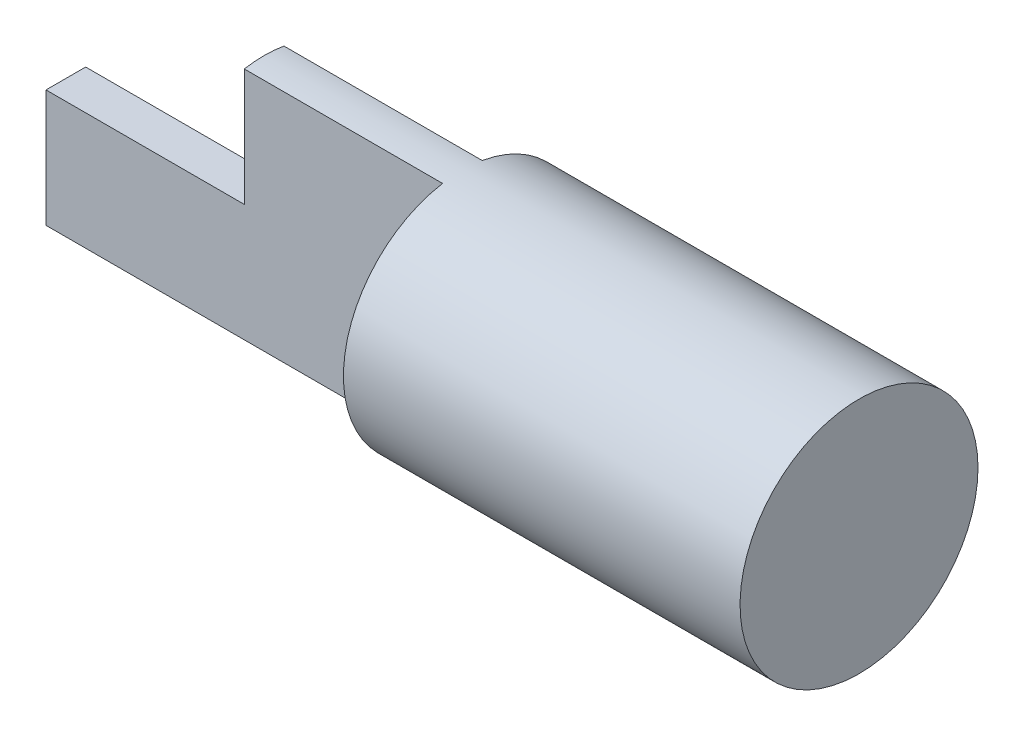
ISO-10303-21;
HEADER;
FILE_DESCRIPTION(('STEP AP214'),'2;1');
FILE_NAME('part.step','',(''),(''),'','','');
FILE_SCHEMA(('AUTOMOTIVE_DESIGN { 1 0 10303 214 1 1 1 1 }'));
ENDSEC;
DATA;
#1=APPLICATION_CONTEXT('core data for automotive mechanical design processes');
#2=APPLICATION_PROTOCOL_DEFINITION('international standard','automotive_design',2000,#1);
#3=PRODUCT_CONTEXT('',#1,'mechanical');
#4=PRODUCT('Part','Part','',(#3));
#5=PRODUCT_RELATED_PRODUCT_CATEGORY('part','',(#4));
#6=PRODUCT_DEFINITION_FORMATION('','',#4);
#7=PRODUCT_DEFINITION_CONTEXT('part definition',#1,'design');
#8=PRODUCT_DEFINITION('design','',#6,#7);
#9=PRODUCT_DEFINITION_SHAPE('','',#8);
#10=(LENGTH_UNIT() NAMED_UNIT(*) SI_UNIT(.MILLI.,.METRE.));
#11=(NAMED_UNIT(*) PLANE_ANGLE_UNIT() SI_UNIT($,.RADIAN.));
#12=(NAMED_UNIT(*) SI_UNIT($,.STERADIAN.) SOLID_ANGLE_UNIT());
#13=UNCERTAINTY_MEASURE_WITH_UNIT(LENGTH_MEASURE(1.E-05),#10,'distance_accuracy_value','');
#14=(GEOMETRIC_REPRESENTATION_CONTEXT(3) GLOBAL_UNCERTAINTY_ASSIGNED_CONTEXT((#13)) GLOBAL_UNIT_ASSIGNED_CONTEXT((#10,
#11,#12)) REPRESENTATION_CONTEXT('',''));
#15=CARTESIAN_POINT('',(0.,0.,0.));
#16=DIRECTION('',(0.,0.,1.));
#17=DIRECTION('',(1.,0.,0.));
#18=AXIS2_PLACEMENT_3D('',#15,#16,#17);
#19=CARTESIAN_POINT('',(-50.,1.19348975147204E-12,0.));
#20=DIRECTION('',(-1.,0.,0.));
#21=DIRECTION('',(0.,0.,1.));
#22=AXIS2_PLACEMENT_3D('',#19,#20,#21);
#23=PLANE('',#22);
#24=DIRECTION('',(0.,-1.,0.));
#25=VECTOR('',#24,1.);
#26=CARTESIAN_POINT('',(-50.,29.5803989154981,-4.99999999999999));
#27=LINE('',#26,#25);
#28=CARTESIAN_POINT('',(-50.,29.5803989154981,-4.99999999999999));
#29=VERTEX_POINT('',#28);
#30=CARTESIAN_POINT('',(-50.,0.,-4.99999999999999));
#31=VERTEX_POINT('',#30);
#32=EDGE_CURVE('E123',#29,#31,#27,.T.);
#33=ORIENTED_EDGE('',*,*,#32,.T.);
#34=DIRECTION('',(0.,0.,1.));
#35=VECTOR('',#34,1.);
#36=CARTESIAN_POINT('',(-50.,0.,0.));
#37=LINE('',#36,#35);
#38=CARTESIAN_POINT('',(-50.,0.,5.));
#39=VERTEX_POINT('',#38);
#40=EDGE_CURVE('E94',#31,#39,#37,.T.);
#41=ORIENTED_EDGE('',*,*,#40,.T.);
#42=DIRECTION('',(0.,1.,0.));
#43=VECTOR('',#42,1.);
#44=CARTESIAN_POINT('',(-50.,-29.5803989154981,5.));
#45=LINE('',#44,#43);
#46=CARTESIAN_POINT('',(-50.,29.5803989154981,5.));
#47=VERTEX_POINT('',#46);
#48=EDGE_CURVE('E129',#39,#47,#45,.T.);
#49=ORIENTED_EDGE('',*,*,#48,.T.);
#50=CARTESIAN_POINT('',(-50.,-3.64291929955129E-13,0.));
#51=DIRECTION('',(-1.,0.,0.));
#52=DIRECTION('',(0.,0.,-1.));
#53=AXIS2_PLACEMENT_3D('',#50,#51,#52);
#54=CIRCLE('',#53,30.0000000000004);
#55=EDGE_CURVE('E128',#47,#29,#54,.T.);
#56=ORIENTED_EDGE('',*,*,#55,.T.);
#57=EDGE_LOOP('',(#33,#41,#49,#56));
#58=FACE_BOUND('',#57,.T.);
#59=ADVANCED_FACE('F35',(#58),#23,.T.);
#60=CARTESIAN_POINT('',(0.,0.,0.));
#61=DIRECTION('',(1.,0.,0.));
#62=DIRECTION('',(0.,0.,-1.));
#63=AXIS2_PLACEMENT_3D('',#60,#61,#62);
#64=PLANE('',#63);
#65=DIRECTION('',(0.,-1.,0.));
#66=VECTOR('',#65,1.);
#67=CARTESIAN_POINT('',(0.,29.5803989154981,-4.99999999999999));
#68=LINE('',#67,#66);
#69=CARTESIAN_POINT('',(0.,29.5803989154981,-4.99999999999999));
#70=VERTEX_POINT('',#69);
#71=CARTESIAN_POINT('',(0.,-29.5803989154981,-4.99999999999999));
#72=VERTEX_POINT('',#71);
#73=EDGE_CURVE('E140',#70,#72,#68,.T.);
#74=ORIENTED_EDGE('',*,*,#73,.F.);
#75=CARTESIAN_POINT('',(0.,0.,0.));
#76=DIRECTION('',(1.,0.,0.));
#77=DIRECTION('',(0.,0.,-1.));
#78=AXIS2_PLACEMENT_3D('',#75,#76,#77);
#79=CIRCLE('',#78,30.);
#80=EDGE_CURVE('E59',#72,#70,#79,.T.);
#81=ORIENTED_EDGE('',*,*,#80,.F.);
#82=EDGE_LOOP('',(#74,#81));
#83=FACE_BOUND('',#82,.T.);
#84=ADVANCED_FACE('F173',(#83),#64,.F.);
#85=DIRECTION('',(0.,1.,0.));
#86=VECTOR('',#85,1.);
#87=CARTESIAN_POINT('',(0.,-29.5803989154981,5.));
#88=LINE('',#87,#86);
#89=CARTESIAN_POINT('',(0.,-29.5803989154981,5.));
#90=VERTEX_POINT('',#89);
#91=CARTESIAN_POINT('',(0.,29.5803989154981,5.));
#92=VERTEX_POINT('',#91);
#93=EDGE_CURVE('E98',#90,#92,#88,.T.);
#94=ORIENTED_EDGE('',*,*,#93,.F.);
#95=EDGE_CURVE('E44',#92,#90,#79,.T.);
#96=ORIENTED_EDGE('',*,*,#95,.F.);
#97=EDGE_LOOP('',(#94,#96));
#98=FACE_BOUND('',#97,.T.);
#99=ADVANCED_FACE('F178',(#98),#64,.F.);
#100=CARTESIAN_POINT('',(100.,0.,0.));
#101=DIRECTION('',(-1.,0.,0.));
#102=DIRECTION('',(0.,0.,1.));
#103=AXIS2_PLACEMENT_3D('',#100,#101,#102);
#104=CYLINDRICAL_SURFACE('',#103,30.);
#105=CARTESIAN_POINT('',(100.,0.,0.));
#106=DIRECTION('',(1.,0.,0.));
#107=DIRECTION('',(0.,0.,-1.));
#108=AXIS2_PLACEMENT_3D('',#105,#106,#107);
#109=CIRCLE('',#108,30.);
#110=CARTESIAN_POINT('',(100.,0.,-30.));
#111=VERTEX_POINT('',#110);
#112=EDGE_CURVE('E11',#111,#111,#109,.T.);
#113=ORIENTED_EDGE('',*,*,#112,.F.);
#114=EDGE_LOOP('',(#113));
#115=FACE_BOUND('',#114,.T.);
#116=ORIENTED_EDGE('',*,*,#80,.T.);
#117=DIRECTION('',(1.,0.,0.));
#118=VECTOR('',#117,1.);
#119=CARTESIAN_POINT('',(-50.,29.5803989154981,-4.99999999999999));
#120=LINE('',#119,#118);
#121=EDGE_CURVE('E147',#29,#70,#120,.T.);
#122=ORIENTED_EDGE('',*,*,#121,.F.);
#123=ORIENTED_EDGE('',*,*,#55,.F.);
#124=DIRECTION('',(1.,0.,0.));
#125=VECTOR('',#124,1.);
#126=CARTESIAN_POINT('',(-50.,29.5803989154981,5.));
#127=LINE('',#126,#125);
#128=EDGE_CURVE('E143',#47,#92,#127,.T.);
#129=ORIENTED_EDGE('',*,*,#128,.T.);
#130=ORIENTED_EDGE('',*,*,#95,.T.);
#131=DIRECTION('',(1.,0.,0.));
#132=VECTOR('',#131,1.);
#133=CARTESIAN_POINT('',(-50.,-29.5803989154981,5.));
#134=LINE('',#133,#132);
#135=CARTESIAN_POINT('',(-100.,-29.5803989154981,5.));
#136=VERTEX_POINT('',#135);
#137=EDGE_CURVE('E146',#136,#90,#134,.T.);
#138=ORIENTED_EDGE('',*,*,#137,.F.);
#139=CARTESIAN_POINT('',(-100.,1.19348975147204E-12,0.));
#140=DIRECTION('',(-1.,0.,0.));
#141=DIRECTION('',(0.,0.,1.));
#142=AXIS2_PLACEMENT_3D('',#139,#140,#141);
#143=CIRCLE('',#142,30.0000000000012);
#144=CARTESIAN_POINT('',(-100.,-29.5803989154981,-4.99999999999999));
#145=VERTEX_POINT('',#144);
#146=EDGE_CURVE('E107',#145,#136,#143,.T.);
#147=ORIENTED_EDGE('',*,*,#146,.F.);
#148=DIRECTION('',(1.,0.,0.));
#149=VECTOR('',#148,1.);
#150=CARTESIAN_POINT('',(-50.,-29.5803989154981,-4.99999999999999));
#151=LINE('',#150,#149);
#152=EDGE_CURVE('E103',#145,#72,#151,.T.);
#153=ORIENTED_EDGE('',*,*,#152,.T.);
#154=EDGE_LOOP('',(#116,#122,#123,#129,#130,#138,#147,#153));
#155=FACE_BOUND('',#154,.T.);
#156=ADVANCED_FACE('F37',(#115,#155),#104,.T.);
#157=CARTESIAN_POINT('',(100.,0.,0.));
#158=DIRECTION('',(1.,0.,0.));
#159=DIRECTION('',(0.,0.,-1.));
#160=AXIS2_PLACEMENT_3D('',#157,#158,#159);
#161=PLANE('',#160);
#162=ORIENTED_EDGE('',*,*,#112,.T.);
#163=EDGE_LOOP('',(#162));
#164=FACE_BOUND('',#163,.T.);
#165=ADVANCED_FACE('F186',(#164),#161,.T.);
#166=CARTESIAN_POINT('',(-50.,-29.5803989154981,5.));
#167=DIRECTION('',(0.,0.,-1.));
#168=DIRECTION('',(-1.,0.,0.));
#169=AXIS2_PLACEMENT_3D('',#166,#167,#168);
#170=PLANE('',#169);
#171=ORIENTED_EDGE('',*,*,#93,.T.);
#172=ORIENTED_EDGE('',*,*,#128,.F.);
#173=ORIENTED_EDGE('',*,*,#48,.F.);
#174=DIRECTION('',(1.,0.,0.));
#175=VECTOR('',#174,1.);
#176=CARTESIAN_POINT('',(-100.,0.,5.));
#177=LINE('',#176,#175);
#178=CARTESIAN_POINT('',(-100.,0.,5.));
#179=VERTEX_POINT('',#178);
#180=EDGE_CURVE('E52',#179,#39,#177,.T.);
#181=ORIENTED_EDGE('',*,*,#180,.F.);
#182=DIRECTION('',(0.,1.,0.));
#183=VECTOR('',#182,1.);
#184=CARTESIAN_POINT('',(-100.,0.,5.));
#185=LINE('',#184,#183);
#186=EDGE_CURVE('E111',#136,#179,#185,.T.);
#187=ORIENTED_EDGE('',*,*,#186,.F.);
#188=ORIENTED_EDGE('',*,*,#137,.T.);
#189=EDGE_LOOP('',(#171,#172,#173,#181,#187,#188));
#190=FACE_BOUND('',#189,.T.);
#191=ADVANCED_FACE('F169',(#190),#170,.F.);
#192=CARTESIAN_POINT('',(-50.,29.5803989154981,-4.99999999999999));
#193=DIRECTION('',(0.,0.,1.));
#194=DIRECTION('',(1.,0.,0.));
#195=AXIS2_PLACEMENT_3D('',#192,#193,#194);
#196=PLANE('',#195);
#197=ORIENTED_EDGE('',*,*,#73,.T.);
#198=ORIENTED_EDGE('',*,*,#152,.F.);
#199=DIRECTION('',(0.,-1.,0.));
#200=VECTOR('',#199,1.);
#201=CARTESIAN_POINT('',(-100.,0.,-4.99999999999999));
#202=LINE('',#201,#200);
#203=CARTESIAN_POINT('',(-100.,0.,-4.99999999999999));
#204=VERTEX_POINT('',#203);
#205=EDGE_CURVE('E100',#204,#145,#202,.T.);
#206=ORIENTED_EDGE('',*,*,#205,.F.);
#207=DIRECTION('',(1.,0.,0.));
#208=VECTOR('',#207,1.);
#209=CARTESIAN_POINT('',(-100.,0.,-4.99999999999999));
#210=LINE('',#209,#208);
#211=EDGE_CURVE('E89',#204,#31,#210,.T.);
#212=ORIENTED_EDGE('',*,*,#211,.T.);
#213=ORIENTED_EDGE('',*,*,#32,.F.);
#214=ORIENTED_EDGE('',*,*,#121,.T.);
#215=EDGE_LOOP('',(#197,#198,#206,#212,#213,#214));
#216=FACE_BOUND('',#215,.T.);
#217=ADVANCED_FACE('F101',(#216),#196,.F.);
#218=CARTESIAN_POINT('',(-100.,0.,0.));
#219=DIRECTION('',(0.,1.,0.));
#220=DIRECTION('',(0.,0.,1.));
#221=AXIS2_PLACEMENT_3D('',#218,#219,#220);
#222=PLANE('',#221);
#223=ORIENTED_EDGE('',*,*,#40,.F.);
#224=ORIENTED_EDGE('',*,*,#211,.F.);
#225=DIRECTION('',(0.,0.,1.));
#226=VECTOR('',#225,1.);
#227=CARTESIAN_POINT('',(-100.,0.,0.));
#228=LINE('',#227,#226);
#229=EDGE_CURVE('E93',#204,#179,#228,.T.);
#230=ORIENTED_EDGE('',*,*,#229,.T.);
#231=ORIENTED_EDGE('',*,*,#180,.T.);
#232=EDGE_LOOP('',(#223,#224,#230,#231));
#233=FACE_BOUND('',#232,.T.);
#234=ADVANCED_FACE('F91',(#233),#222,.T.);
#235=CARTESIAN_POINT('',(-100.,0.,0.));
#236=DIRECTION('',(-1.,0.,0.));
#237=DIRECTION('',(0.,0.,1.));
#238=AXIS2_PLACEMENT_3D('',#235,#236,#237);
#239=PLANE('',#238);
#240=ORIENTED_EDGE('',*,*,#229,.F.);
#241=ORIENTED_EDGE('',*,*,#205,.T.);
#242=ORIENTED_EDGE('',*,*,#146,.T.);
#243=ORIENTED_EDGE('',*,*,#186,.T.);
#244=EDGE_LOOP('',(#240,#241,#242,#243));
#245=FACE_BOUND('',#244,.T.);
#246=ADVANCED_FACE('F109',(#245),#239,.T.);
#247=CLOSED_SHELL('',(#59,#84,#99,#156,#165,#191,#217,#234,#246));
#248=MANIFOLD_SOLID_BREP('B2',#247);
#249=ADVANCED_BREP_SHAPE_REPRESENTATION('',(#18,#248),#14);
#250=SHAPE_DEFINITION_REPRESENTATION(#9,#249);
ENDSEC;
END-ISO-10303-21;
